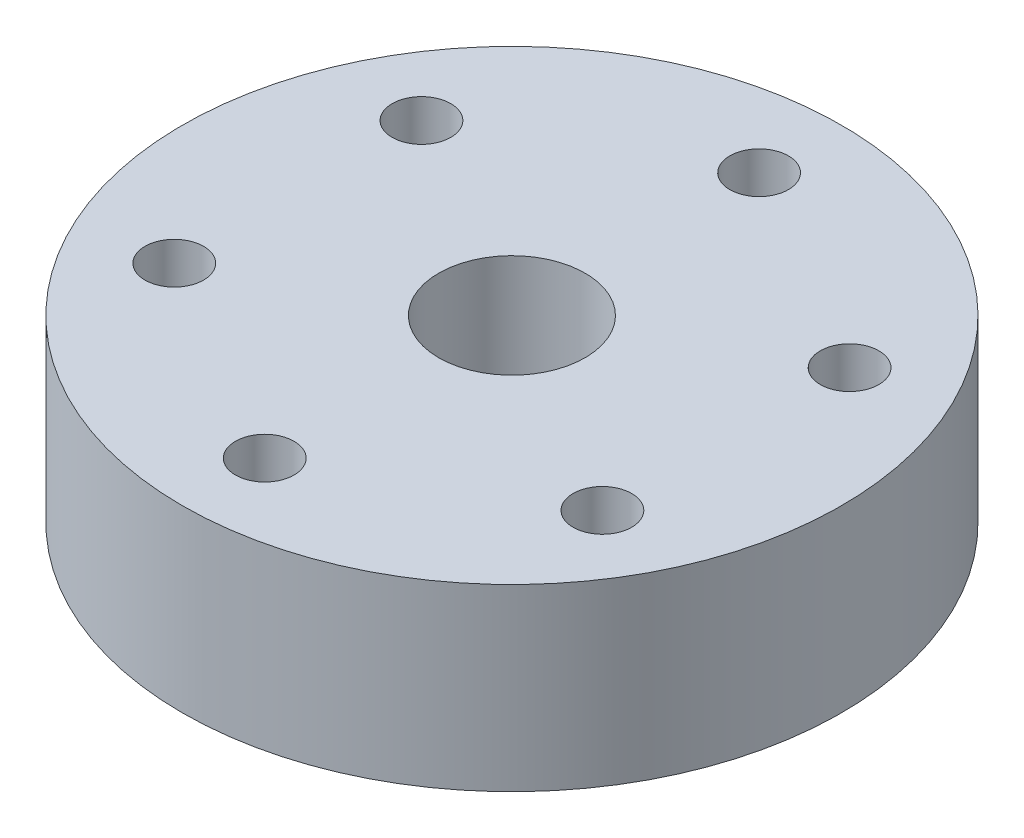
ISO-10303-21;
HEADER;
FILE_DESCRIPTION(('STEP AP214'),'2;1');
FILE_NAME('part.step','',(''),(''),'','','');
FILE_SCHEMA(('AUTOMOTIVE_DESIGN { 1 0 10303 214 1 1 1 1 }'));
ENDSEC;
DATA;
#1=APPLICATION_CONTEXT('core data for automotive mechanical design processes');
#2=APPLICATION_PROTOCOL_DEFINITION('international standard','automotive_design',2000,#1);
#3=PRODUCT_CONTEXT('',#1,'mechanical');
#4=PRODUCT('Part','Part','',(#3));
#5=PRODUCT_RELATED_PRODUCT_CATEGORY('part','',(#4));
#6=PRODUCT_DEFINITION_FORMATION('','',#4);
#7=PRODUCT_DEFINITION_CONTEXT('part definition',#1,'design');
#8=PRODUCT_DEFINITION('design','',#6,#7);
#9=PRODUCT_DEFINITION_SHAPE('','',#8);
#10=(LENGTH_UNIT() NAMED_UNIT(*) SI_UNIT(.MILLI.,.METRE.));
#11=(NAMED_UNIT(*) PLANE_ANGLE_UNIT() SI_UNIT($,.RADIAN.));
#12=(NAMED_UNIT(*) SI_UNIT($,.STERADIAN.) SOLID_ANGLE_UNIT());
#13=UNCERTAINTY_MEASURE_WITH_UNIT(LENGTH_MEASURE(1.E-05),#10,'distance_accuracy_value','');
#14=(GEOMETRIC_REPRESENTATION_CONTEXT(3) GLOBAL_UNCERTAINTY_ASSIGNED_CONTEXT((#13)) GLOBAL_UNIT_ASSIGNED_CONTEXT((#10,
#11,#12)) REPRESENTATION_CONTEXT('',''));
#15=CARTESIAN_POINT('',(0.,0.,0.));
#16=DIRECTION('',(0.,0.,1.));
#17=DIRECTION('',(1.,0.,0.));
#18=AXIS2_PLACEMENT_3D('',#15,#16,#17);
#19=CARTESIAN_POINT('',(40.,8.,-10.8));
#20=DIRECTION('',(0.,1.,0.));
#21=DIRECTION('',(0.,0.,1.));
#22=AXIS2_PLACEMENT_3D('',#19,#20,#21);
#23=PLANE('',#22);
#24=CARTESIAN_POINT('',(10.,8.00000000000001,-13.5));
#25=DIRECTION('',(0.,1.,0.));
#26=DIRECTION('',(0.,0.,1.));
#27=AXIS2_PLACEMENT_3D('',#24,#25,#26);
#28=CIRCLE('',#27,1.6);
#29=CARTESIAN_POINT('',(10.,8.00000000000001,-11.9));
#30=VERTEX_POINT('',#29);
#31=EDGE_CURVE('E69',#30,#30,#28,.T.);
#32=ORIENTED_EDGE('',*,*,#31,.T.);
#33=EDGE_LOOP('',(#32));
#34=FACE_BOUND('',#33,.T.);
#35=CARTESIAN_POINT('',(10.,8.00000000000001,0.));
#36=DIRECTION('',(0.,1.,0.));
#37=DIRECTION('',(0.,0.,1.));
#38=AXIS2_PLACEMENT_3D('',#35,#36,#37);
#39=CIRCLE('',#38,4.);
#40=CARTESIAN_POINT('',(10.,8.00000000000001,4.));
#41=VERTEX_POINT('',#40);
#42=EDGE_CURVE('E72',#41,#41,#39,.T.);
#43=ORIENTED_EDGE('',*,*,#42,.T.);
#44=EDGE_LOOP('',(#43));
#45=FACE_BOUND('',#44,.T.);
#46=CARTESIAN_POINT('',(21.6913429510899,8.00000000000001,-6.75));
#47=DIRECTION('',(0.,1.,0.));
#48=DIRECTION('',(0.,0.,1.));
#49=AXIS2_PLACEMENT_3D('',#46,#47,#48);
#50=CIRCLE('',#49,1.60000000000001);
#51=CARTESIAN_POINT('',(21.6913429510899,8.00000000000001,-5.15));
#52=VERTEX_POINT('',#51);
#53=EDGE_CURVE('E75',#52,#52,#50,.T.);
#54=ORIENTED_EDGE('',*,*,#53,.T.);
#55=EDGE_LOOP('',(#54));
#56=FACE_BOUND('',#55,.T.);
#57=CARTESIAN_POINT('',(21.6913429510899,8.00000000000001,6.75));
#58=DIRECTION('',(0.,1.,0.));
#59=DIRECTION('',(0.,0.,1.));
#60=AXIS2_PLACEMENT_3D('',#57,#58,#59);
#61=CIRCLE('',#60,1.60000000000001);
#62=CARTESIAN_POINT('',(21.6913429510899,8.00000000000001,8.35));
#63=VERTEX_POINT('',#62);
#64=EDGE_CURVE('E78',#63,#63,#61,.T.);
#65=ORIENTED_EDGE('',*,*,#64,.T.);
#66=EDGE_LOOP('',(#65));
#67=FACE_BOUND('',#66,.T.);
#68=CARTESIAN_POINT('',(10.,8.00000000000001,13.5));
#69=DIRECTION('',(0.,1.,0.));
#70=DIRECTION('',(0.,0.,1.));
#71=AXIS2_PLACEMENT_3D('',#68,#69,#70);
#72=CIRCLE('',#71,1.6);
#73=CARTESIAN_POINT('',(10.,8.00000000000001,15.1));
#74=VERTEX_POINT('',#73);
#75=EDGE_CURVE('E81',#74,#74,#72,.T.);
#76=ORIENTED_EDGE('',*,*,#75,.T.);
#77=EDGE_LOOP('',(#76));
#78=FACE_BOUND('',#77,.T.);
#79=CARTESIAN_POINT('',(-1.69134295108992,8.00000000000001,6.75000000000001));
#80=DIRECTION('',(0.,1.,0.));
#81=DIRECTION('',(0.,0.,1.));
#82=AXIS2_PLACEMENT_3D('',#79,#80,#81);
#83=CIRCLE('',#82,1.60000000000001);
#84=CARTESIAN_POINT('',(-1.69134295108992,8.00000000000001,8.35000000000001));
#85=VERTEX_POINT('',#84);
#86=EDGE_CURVE('E84',#85,#85,#83,.T.);
#87=ORIENTED_EDGE('',*,*,#86,.T.);
#88=EDGE_LOOP('',(#87));
#89=FACE_BOUND('',#88,.T.);
#90=CARTESIAN_POINT('',(-1.69134295108992,8.00000000000001,-6.75));
#91=DIRECTION('',(0.,1.,0.));
#92=DIRECTION('',(0.,0.,1.));
#93=AXIS2_PLACEMENT_3D('',#90,#91,#92);
#94=CIRCLE('',#93,1.6);
#95=CARTESIAN_POINT('',(-1.69134295108992,8.00000000000001,-5.15));
#96=VERTEX_POINT('',#95);
#97=EDGE_CURVE('E86',#96,#96,#94,.T.);
#98=ORIENTED_EDGE('',*,*,#97,.T.);
#99=EDGE_LOOP('',(#98));
#100=FACE_BOUND('',#99,.T.);
#101=CARTESIAN_POINT('',(10.,8.,0.));
#102=DIRECTION('',(0.,1.,0.));
#103=DIRECTION('',(0.,0.,1.));
#104=AXIS2_PLACEMENT_3D('',#101,#102,#103);
#105=CIRCLE('',#104,18.);
#106=CARTESIAN_POINT('',(10.,8.,18.));
#107=VERTEX_POINT('',#106);
#108=EDGE_CURVE('E41',#107,#107,#105,.T.);
#109=ORIENTED_EDGE('',*,*,#108,.F.);
#110=EDGE_LOOP('',(#109));
#111=FACE_BOUND('',#110,.T.);
#112=ADVANCED_FACE('F37',(#34,#45,#56,#67,#78,#89,#100,#111),#23,.F.);
#113=CARTESIAN_POINT('',(10.,17.8,0.));
#114=DIRECTION('',(0.,-1.,0.));
#115=DIRECTION('',(0.,0.,-1.));
#116=AXIS2_PLACEMENT_3D('',#113,#114,#115);
#117=CYLINDRICAL_SURFACE('',#116,18.);
#118=CARTESIAN_POINT('',(10.,17.8,0.));
#119=DIRECTION('',(0.,1.,0.));
#120=DIRECTION('',(0.,0.,1.));
#121=AXIS2_PLACEMENT_3D('',#118,#119,#120);
#122=CIRCLE('',#121,18.);
#123=CARTESIAN_POINT('',(10.,17.8,18.));
#124=VERTEX_POINT('',#123);
#125=EDGE_CURVE('E53',#124,#124,#122,.T.);
#126=ORIENTED_EDGE('',*,*,#125,.F.);
#127=EDGE_LOOP('',(#126));
#128=FACE_BOUND('',#127,.T.);
#129=ORIENTED_EDGE('',*,*,#108,.T.);
#130=EDGE_LOOP('',(#129));
#131=FACE_BOUND('',#130,.T.);
#132=ADVANCED_FACE('F96',(#128,#131),#117,.T.);
#133=CARTESIAN_POINT('',(10.,17.8,0.));
#134=DIRECTION('',(0.,1.,0.));
#135=DIRECTION('',(0.,0.,1.));
#136=AXIS2_PLACEMENT_3D('',#133,#134,#135);
#137=PLANE('',#136);
#138=CARTESIAN_POINT('',(10.,17.8,-13.5));
#139=DIRECTION('',(0.,1.,0.));
#140=DIRECTION('',(0.,0.,1.));
#141=AXIS2_PLACEMENT_3D('',#138,#139,#140);
#142=CIRCLE('',#141,1.6);
#143=CARTESIAN_POINT('',(10.,17.8,-11.9));
#144=VERTEX_POINT('',#143);
#145=EDGE_CURVE('E66',#144,#144,#142,.T.);
#146=ORIENTED_EDGE('',*,*,#145,.F.);
#147=EDGE_LOOP('',(#146));
#148=FACE_BOUND('',#147,.T.);
#149=CARTESIAN_POINT('',(10.,17.8,0.));
#150=DIRECTION('',(0.,1.,0.));
#151=DIRECTION('',(0.,0.,1.));
#152=AXIS2_PLACEMENT_3D('',#149,#150,#151);
#153=CIRCLE('',#152,4.);
#154=CARTESIAN_POINT('',(10.,17.8,4.));
#155=VERTEX_POINT('',#154);
#156=EDGE_CURVE('E63',#155,#155,#153,.T.);
#157=ORIENTED_EDGE('',*,*,#156,.F.);
#158=EDGE_LOOP('',(#157));
#159=FACE_BOUND('',#158,.T.);
#160=CARTESIAN_POINT('',(21.6913429510899,17.8,-6.75));
#161=DIRECTION('',(0.,1.,0.));
#162=DIRECTION('',(0.,0.,1.));
#163=AXIS2_PLACEMENT_3D('',#160,#161,#162);
#164=CIRCLE('',#163,1.60000000000001);
#165=CARTESIAN_POINT('',(21.6913429510899,17.8,-5.15));
#166=VERTEX_POINT('',#165);
#167=EDGE_CURVE('E60',#166,#166,#164,.T.);
#168=ORIENTED_EDGE('',*,*,#167,.F.);
#169=EDGE_LOOP('',(#168));
#170=FACE_BOUND('',#169,.T.);
#171=CARTESIAN_POINT('',(21.6913429510899,17.8,6.75));
#172=DIRECTION('',(0.,1.,0.));
#173=DIRECTION('',(0.,0.,1.));
#174=AXIS2_PLACEMENT_3D('',#171,#172,#173);
#175=CIRCLE('',#174,1.60000000000001);
#176=CARTESIAN_POINT('',(21.6913429510899,17.8,8.35));
#177=VERTEX_POINT('',#176);
#178=EDGE_CURVE('E57',#177,#177,#175,.T.);
#179=ORIENTED_EDGE('',*,*,#178,.F.);
#180=EDGE_LOOP('',(#179));
#181=FACE_BOUND('',#180,.T.);
#182=CARTESIAN_POINT('',(10.,17.8,13.5));
#183=DIRECTION('',(0.,1.,0.));
#184=DIRECTION('',(0.,0.,1.));
#185=AXIS2_PLACEMENT_3D('',#182,#183,#184);
#186=CIRCLE('',#185,1.6);
#187=CARTESIAN_POINT('',(10.,17.8,15.1));
#188=VERTEX_POINT('',#187);
#189=EDGE_CURVE('E50',#188,#188,#186,.T.);
#190=ORIENTED_EDGE('',*,*,#189,.F.);
#191=EDGE_LOOP('',(#190));
#192=FACE_BOUND('',#191,.T.);
#193=CARTESIAN_POINT('',(-1.69134295108992,17.8,6.75000000000001));
#194=DIRECTION('',(0.,1.,0.));
#195=DIRECTION('',(0.,0.,1.));
#196=AXIS2_PLACEMENT_3D('',#193,#194,#195);
#197=CIRCLE('',#196,1.60000000000001);
#198=CARTESIAN_POINT('',(-1.69134295108992,17.8,8.35000000000001));
#199=VERTEX_POINT('',#198);
#200=EDGE_CURVE('E45',#199,#199,#197,.T.);
#201=ORIENTED_EDGE('',*,*,#200,.F.);
#202=EDGE_LOOP('',(#201));
#203=FACE_BOUND('',#202,.T.);
#204=CARTESIAN_POINT('',(-1.69134295108992,17.8,-6.75));
#205=DIRECTION('',(0.,1.,0.));
#206=DIRECTION('',(0.,0.,1.));
#207=AXIS2_PLACEMENT_3D('',#204,#205,#206);
#208=CIRCLE('',#207,1.6);
#209=CARTESIAN_POINT('',(-1.69134295108992,17.8,-5.15));
#210=VERTEX_POINT('',#209);
#211=EDGE_CURVE('E10',#210,#210,#208,.T.);
#212=ORIENTED_EDGE('',*,*,#211,.F.);
#213=EDGE_LOOP('',(#212));
#214=FACE_BOUND('',#213,.T.);
#215=ORIENTED_EDGE('',*,*,#125,.T.);
#216=EDGE_LOOP('',(#215));
#217=FACE_BOUND('',#216,.T.);
#218=ADVANCED_FACE('F104',(#148,#159,#170,#181,#192,#203,#214,#217),#137,.T.);
#219=CARTESIAN_POINT('',(-1.69134295108992,81.901,-6.75));
#220=DIRECTION('',(0.,-1.,0.));
#221=DIRECTION('',(0.,0.,-1.));
#222=AXIS2_PLACEMENT_3D('',#219,#220,#221);
#223=CYLINDRICAL_SURFACE('',#222,1.6);
#224=ORIENTED_EDGE('',*,*,#97,.F.);
#225=EDGE_LOOP('',(#224));
#226=FACE_BOUND('',#225,.T.);
#227=ORIENTED_EDGE('',*,*,#211,.T.);
#228=EDGE_LOOP('',(#227));
#229=FACE_BOUND('',#228,.T.);
#230=ADVANCED_FACE('F39',(#226,#229),#223,.F.);
#231=CARTESIAN_POINT('',(-1.69134295108992,81.901,6.75000000000001));
#232=DIRECTION('',(0.,-1.,0.));
#233=DIRECTION('',(0.,0.,-1.));
#234=AXIS2_PLACEMENT_3D('',#231,#232,#233);
#235=CYLINDRICAL_SURFACE('',#234,1.60000000000001);
#236=ORIENTED_EDGE('',*,*,#86,.F.);
#237=EDGE_LOOP('',(#236));
#238=FACE_BOUND('',#237,.T.);
#239=ORIENTED_EDGE('',*,*,#200,.T.);
#240=EDGE_LOOP('',(#239));
#241=FACE_BOUND('',#240,.T.);
#242=ADVANCED_FACE('F128',(#238,#241),#235,.F.);
#243=CARTESIAN_POINT('',(10.,81.901,13.5));
#244=DIRECTION('',(0.,-1.,0.));
#245=DIRECTION('',(0.,0.,-1.));
#246=AXIS2_PLACEMENT_3D('',#243,#244,#245);
#247=CYLINDRICAL_SURFACE('',#246,1.6);
#248=ORIENTED_EDGE('',*,*,#75,.F.);
#249=EDGE_LOOP('',(#248));
#250=FACE_BOUND('',#249,.T.);
#251=ORIENTED_EDGE('',*,*,#189,.T.);
#252=EDGE_LOOP('',(#251));
#253=FACE_BOUND('',#252,.T.);
#254=ADVANCED_FACE('F125',(#250,#253),#247,.F.);
#255=CARTESIAN_POINT('',(21.6913429510899,81.901,6.75));
#256=DIRECTION('',(0.,-1.,0.));
#257=DIRECTION('',(0.,0.,-1.));
#258=AXIS2_PLACEMENT_3D('',#255,#256,#257);
#259=CYLINDRICAL_SURFACE('',#258,1.60000000000001);
#260=ORIENTED_EDGE('',*,*,#64,.F.);
#261=EDGE_LOOP('',(#260));
#262=FACE_BOUND('',#261,.T.);
#263=ORIENTED_EDGE('',*,*,#178,.T.);
#264=EDGE_LOOP('',(#263));
#265=FACE_BOUND('',#264,.T.);
#266=ADVANCED_FACE('F121',(#262,#265),#259,.F.);
#267=CARTESIAN_POINT('',(21.6913429510899,81.901,-6.75));
#268=DIRECTION('',(0.,-1.,0.));
#269=DIRECTION('',(0.,0.,-1.));
#270=AXIS2_PLACEMENT_3D('',#267,#268,#269);
#271=CYLINDRICAL_SURFACE('',#270,1.60000000000001);
#272=ORIENTED_EDGE('',*,*,#53,.F.);
#273=EDGE_LOOP('',(#272));
#274=FACE_BOUND('',#273,.T.);
#275=ORIENTED_EDGE('',*,*,#167,.T.);
#276=EDGE_LOOP('',(#275));
#277=FACE_BOUND('',#276,.T.);
#278=ADVANCED_FACE('F117',(#274,#277),#271,.F.);
#279=CARTESIAN_POINT('',(10.,81.901,0.));
#280=DIRECTION('',(0.,-1.,0.));
#281=DIRECTION('',(0.,0.,-1.));
#282=AXIS2_PLACEMENT_3D('',#279,#280,#281);
#283=CYLINDRICAL_SURFACE('',#282,4.);
#284=ORIENTED_EDGE('',*,*,#42,.F.);
#285=EDGE_LOOP('',(#284));
#286=FACE_BOUND('',#285,.T.);
#287=ORIENTED_EDGE('',*,*,#156,.T.);
#288=EDGE_LOOP('',(#287));
#289=FACE_BOUND('',#288,.T.);
#290=ADVANCED_FACE('F113',(#286,#289),#283,.F.);
#291=CARTESIAN_POINT('',(10.,81.901,-13.5));
#292=DIRECTION('',(0.,-1.,0.));
#293=DIRECTION('',(0.,0.,-1.));
#294=AXIS2_PLACEMENT_3D('',#291,#292,#293);
#295=CYLINDRICAL_SURFACE('',#294,1.6);
#296=ORIENTED_EDGE('',*,*,#31,.F.);
#297=EDGE_LOOP('',(#296));
#298=FACE_BOUND('',#297,.T.);
#299=ORIENTED_EDGE('',*,*,#145,.T.);
#300=EDGE_LOOP('',(#299));
#301=FACE_BOUND('',#300,.T.);
#302=ADVANCED_FACE('F110',(#298,#301),#295,.F.);
#303=CLOSED_SHELL('',(#112,#132,#218,#230,#242,#254,#266,#278,#290,#302));
#304=MANIFOLD_SOLID_BREP('B2',#303);
#305=ADVANCED_BREP_SHAPE_REPRESENTATION('',(#18,#304),#14);
#306=SHAPE_DEFINITION_REPRESENTATION(#9,#305);
ENDSEC;
END-ISO-10303-21;
